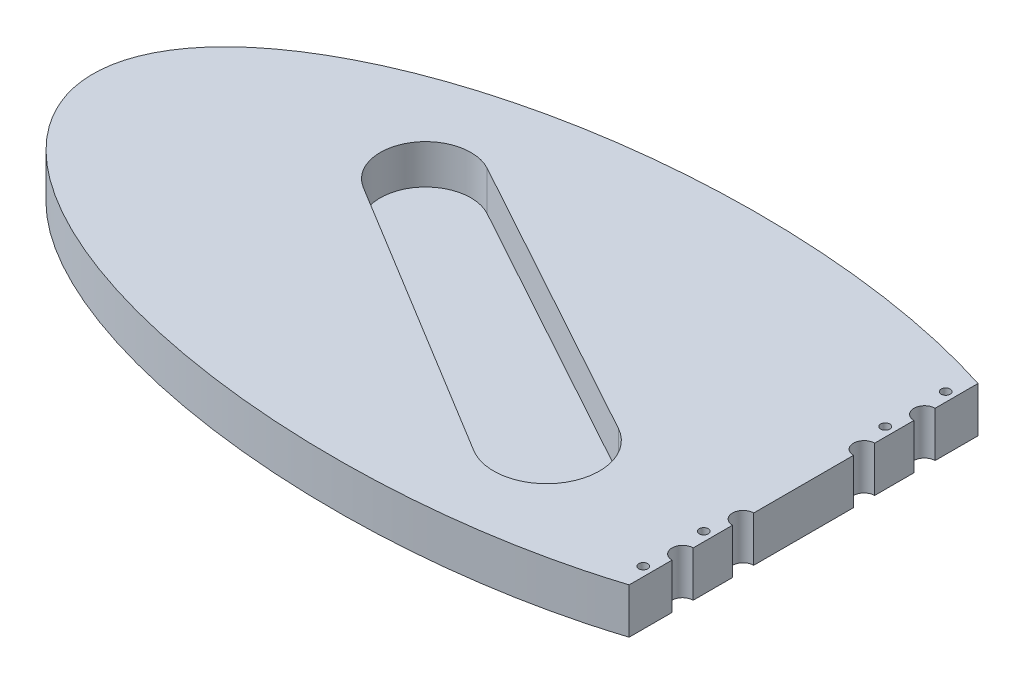
ISO-10303-21;
HEADER;
FILE_DESCRIPTION(('STEP AP214'),'2;1');
FILE_NAME('part.step','',(''),(''),'','','');
FILE_SCHEMA(('AUTOMOTIVE_DESIGN { 1 0 10303 214 1 1 1 1 }'));
ENDSEC;
DATA;
#1=APPLICATION_CONTEXT('core data for automotive mechanical design processes');
#2=APPLICATION_PROTOCOL_DEFINITION('international standard','automotive_design',2000,#1);
#3=PRODUCT_CONTEXT('',#1,'mechanical');
#4=PRODUCT('Part','Part','',(#3));
#5=PRODUCT_RELATED_PRODUCT_CATEGORY('part','',(#4));
#6=PRODUCT_DEFINITION_FORMATION('','',#4);
#7=PRODUCT_DEFINITION_CONTEXT('part definition',#1,'design');
#8=PRODUCT_DEFINITION('design','',#6,#7);
#9=PRODUCT_DEFINITION_SHAPE('','',#8);
#10=(LENGTH_UNIT() NAMED_UNIT(*) SI_UNIT(.MILLI.,.METRE.));
#11=(NAMED_UNIT(*) PLANE_ANGLE_UNIT() SI_UNIT($,.RADIAN.));
#12=(NAMED_UNIT(*) SI_UNIT($,.STERADIAN.) SOLID_ANGLE_UNIT());
#13=UNCERTAINTY_MEASURE_WITH_UNIT(LENGTH_MEASURE(1.E-05),#10,'distance_accuracy_value','');
#14=(GEOMETRIC_REPRESENTATION_CONTEXT(3) GLOBAL_UNCERTAINTY_ASSIGNED_CONTEXT((#13)) GLOBAL_UNIT_ASSIGNED_CONTEXT((#10,
#11,#12)) REPRESENTATION_CONTEXT('',''));
#15=CARTESIAN_POINT('',(0.,0.,0.));
#16=DIRECTION('',(0.,0.,1.));
#17=DIRECTION('',(1.,0.,0.));
#18=AXIS2_PLACEMENT_3D('',#15,#16,#17);
#19=CARTESIAN_POINT('',(84.9999999999999,15.,-57.6762997734387));
#20=DIRECTION('',(-1.,0.,0.));
#21=DIRECTION('',(0.,0.,1.));
#22=AXIS2_PLACEMENT_3D('',#19,#20,#21);
#23=PLANE('',#22);
#24=DIRECTION('',(0.,0.,-1.));
#25=VECTOR('',#24,1.);
#26=CARTESIAN_POINT('',(84.9999999999999,0.,-57.6762997734387));
#27=LINE('',#26,#25);
#28=CARTESIAN_POINT('',(85.,0.,16.5));
#29=VERTEX_POINT('',#28);
#30=CARTESIAN_POINT('',(84.9999999999999,0.,-16.5));
#31=VERTEX_POINT('',#30);
#32=EDGE_CURVE('E168',#29,#31,#27,.T.);
#33=ORIENTED_EDGE('',*,*,#32,.T.);
#34=DIRECTION('',(0.,1.,0.));
#35=VECTOR('',#34,1.);
#36=CARTESIAN_POINT('',(84.9999999999999,0.,-16.5));
#37=LINE('',#36,#35);
#38=CARTESIAN_POINT('',(84.9999999999999,15.,-16.5));
#39=VERTEX_POINT('',#38);
#40=EDGE_CURVE('E64',#31,#39,#37,.T.);
#41=ORIENTED_EDGE('',*,*,#40,.T.);
#42=DIRECTION('',(0.,0.,-1.));
#43=VECTOR('',#42,1.);
#44=CARTESIAN_POINT('',(84.9999999999999,15.,-57.6762997734387));
#45=LINE('',#44,#43);
#46=CARTESIAN_POINT('',(85.,15.,16.5));
#47=VERTEX_POINT('',#46);
#48=EDGE_CURVE('E270',#47,#39,#45,.T.);
#49=ORIENTED_EDGE('',*,*,#48,.F.);
#50=DIRECTION('',(0.,1.,0.));
#51=VECTOR('',#50,1.);
#52=CARTESIAN_POINT('',(85.,0.,16.5));
#53=LINE('',#52,#51);
#54=EDGE_CURVE('E194',#47,#29,#53,.F.);
#55=ORIENTED_EDGE('',*,*,#54,.T.);
#56=EDGE_LOOP('',(#33,#41,#49,#55));
#57=FACE_BOUND('',#56,.T.);
#58=ADVANCED_FACE('F39',(#57),#23,.F.);
#59=CARTESIAN_POINT('',(85.,0.,57.6762997734386));
#60=VERTEX_POINT('',#59);
#61=CARTESIAN_POINT('',(85.,0.,43.5));
#62=VERTEX_POINT('',#61);
#63=EDGE_CURVE('E165',#60,#62,#27,.T.);
#64=ORIENTED_EDGE('',*,*,#63,.T.);
#65=DIRECTION('',(0.,1.,0.));
#66=VECTOR('',#65,1.);
#67=CARTESIAN_POINT('',(85.,0.,43.5));
#68=LINE('',#67,#66);
#69=CARTESIAN_POINT('',(85.,15.,43.5));
#70=VERTEX_POINT('',#69);
#71=EDGE_CURVE('E207',#62,#70,#68,.T.);
#72=ORIENTED_EDGE('',*,*,#71,.T.);
#73=CARTESIAN_POINT('',(85.,15.,57.6762997734386));
#74=VERTEX_POINT('',#73);
#75=EDGE_CURVE('E260',#74,#70,#45,.T.);
#76=ORIENTED_EDGE('',*,*,#75,.F.);
#77=DIRECTION('',(0.,-1.,0.));
#78=VECTOR('',#77,1.);
#79=CARTESIAN_POINT('',(85.,15.,57.6762997734386));
#80=LINE('',#79,#78);
#81=EDGE_CURVE('E147',#74,#60,#80,.T.);
#82=ORIENTED_EDGE('',*,*,#81,.T.);
#83=EDGE_LOOP('',(#64,#72,#76,#82));
#84=FACE_BOUND('',#83,.T.);
#85=ADVANCED_FACE('F372',(#84),#23,.F.);
#86=CARTESIAN_POINT('',(85.,15.,36.5));
#87=VERTEX_POINT('',#86);
#88=CARTESIAN_POINT('',(85.,15.,23.5));
#89=VERTEX_POINT('',#88);
#90=EDGE_CURVE('E264',#87,#89,#45,.T.);
#91=ORIENTED_EDGE('',*,*,#90,.F.);
#92=DIRECTION('',(0.,1.,0.));
#93=VECTOR('',#92,1.);
#94=CARTESIAN_POINT('',(85.,0.,36.5));
#95=LINE('',#94,#93);
#96=CARTESIAN_POINT('',(85.,0.,36.5));
#97=VERTEX_POINT('',#96);
#98=EDGE_CURVE('E213',#87,#97,#95,.F.);
#99=ORIENTED_EDGE('',*,*,#98,.T.);
#100=CARTESIAN_POINT('',(85.,0.,23.5));
#101=VERTEX_POINT('',#100);
#102=EDGE_CURVE('E175',#97,#101,#27,.T.);
#103=ORIENTED_EDGE('',*,*,#102,.T.);
#104=DIRECTION('',(0.,1.,0.));
#105=VECTOR('',#104,1.);
#106=CARTESIAN_POINT('',(85.,0.,23.5));
#107=LINE('',#106,#105);
#108=EDGE_CURVE('E321',#101,#89,#107,.T.);
#109=ORIENTED_EDGE('',*,*,#108,.T.);
#110=EDGE_LOOP('',(#91,#99,#103,#109));
#111=FACE_BOUND('',#110,.T.);
#112=ADVANCED_FACE('F324',(#111),#23,.F.);
#113=CARTESIAN_POINT('',(84.9999999999999,15.,-23.5));
#114=VERTEX_POINT('',#113);
#115=CARTESIAN_POINT('',(84.9999999999999,15.,-36.5));
#116=VERTEX_POINT('',#115);
#117=EDGE_CURVE('E205',#114,#116,#45,.T.);
#118=ORIENTED_EDGE('',*,*,#117,.F.);
#119=DIRECTION('',(0.,1.,0.));
#120=VECTOR('',#119,1.);
#121=CARTESIAN_POINT('',(84.9999999999999,0.,-23.5));
#122=LINE('',#121,#120);
#123=CARTESIAN_POINT('',(84.9999999999999,0.,-23.5));
#124=VERTEX_POINT('',#123);
#125=EDGE_CURVE('E199',#114,#124,#122,.F.);
#126=ORIENTED_EDGE('',*,*,#125,.T.);
#127=CARTESIAN_POINT('',(84.9999999999999,0.,-36.5));
#128=VERTEX_POINT('',#127);
#129=EDGE_CURVE('E163',#124,#128,#27,.T.);
#130=ORIENTED_EDGE('',*,*,#129,.T.);
#131=DIRECTION('',(0.,1.,0.));
#132=VECTOR('',#131,1.);
#133=CARTESIAN_POINT('',(84.9999999999999,0.,-36.5));
#134=LINE('',#133,#132);
#135=EDGE_CURVE('E56',#128,#116,#134,.T.);
#136=ORIENTED_EDGE('',*,*,#135,.T.);
#137=EDGE_LOOP('',(#118,#126,#130,#136));
#138=FACE_BOUND('',#137,.T.);
#139=ADVANCED_FACE('F203',(#138),#23,.F.);
#140=CARTESIAN_POINT('',(0.,15.,0.));
#141=DIRECTION('',(0.,1.,0.));
#142=DIRECTION('',(-1.,0.,0.));
#143=AXIS2_PLACEMENT_3D('',#140,#141,#142);
#144=ELLIPSE('',#143,150.,70.);
#145=DIRECTION('',(0.,-1.,0.));
#146=VECTOR('',#145,1.);
#147=SURFACE_OF_LINEAR_EXTRUSION('',#144,#146);
#148=CARTESIAN_POINT('',(0.,0.,0.));
#149=DIRECTION('',(0.,1.,0.));
#150=DIRECTION('',(-1.,0.,0.));
#151=AXIS2_PLACEMENT_3D('',#148,#149,#150);
#152=ELLIPSE('',#151,150.,70.);
#153=CARTESIAN_POINT('',(84.9999999999999,0.,-57.6762997734387));
#154=VERTEX_POINT('',#153);
#155=EDGE_CURVE('E161',#154,#60,#152,.T.);
#156=ORIENTED_EDGE('',*,*,#155,.T.);
#157=ORIENTED_EDGE('',*,*,#81,.F.);
#158=CARTESIAN_POINT('',(84.9999999999999,15.,-57.6762997734387));
#159=VERTEX_POINT('',#158);
#160=EDGE_CURVE('E174',#159,#74,#144,.T.);
#161=ORIENTED_EDGE('',*,*,#160,.F.);
#162=DIRECTION('',(0.,-1.,0.));
#163=VECTOR('',#162,1.);
#164=CARTESIAN_POINT('',(84.9999999999999,15.,-57.6762997734387));
#165=LINE('',#164,#163);
#166=EDGE_CURVE('E263',#159,#154,#165,.T.);
#167=ORIENTED_EDGE('',*,*,#166,.T.);
#168=EDGE_LOOP('',(#156,#157,#161,#167));
#169=FACE_BOUND('',#168,.T.);
#170=ADVANCED_FACE('F41',(#169),#147,.F.);
#171=CARTESIAN_POINT('',(84.9999999999999,15.,-43.5));
#172=VERTEX_POINT('',#171);
#173=EDGE_CURVE('E154',#172,#159,#45,.T.);
#174=ORIENTED_EDGE('',*,*,#173,.F.);
#175=DIRECTION('',(0.,1.,0.));
#176=VECTOR('',#175,1.);
#177=CARTESIAN_POINT('',(84.9999999999999,0.,-43.5));
#178=LINE('',#177,#176);
#179=CARTESIAN_POINT('',(84.9999999999999,0.,-43.5));
#180=VERTEX_POINT('',#179);
#181=EDGE_CURVE('E140',#172,#180,#178,.F.);
#182=ORIENTED_EDGE('',*,*,#181,.T.);
#183=EDGE_CURVE('E152',#180,#154,#27,.T.);
#184=ORIENTED_EDGE('',*,*,#183,.T.);
#185=ORIENTED_EDGE('',*,*,#166,.F.);
#186=EDGE_LOOP('',(#174,#182,#184,#185));
#187=FACE_BOUND('',#186,.T.);
#188=ADVANCED_FACE('F150',(#187),#23,.F.);
#189=CARTESIAN_POINT('',(0.,15.,0.));
#190=DIRECTION('',(0.,1.,0.));
#191=DIRECTION('',(0.,0.,1.));
#192=AXIS2_PLACEMENT_3D('',#189,#190,#191);
#193=PLANE('',#192);
#194=CARTESIAN_POINT('',(82.,15.,50.));
#195=DIRECTION('',(0.,1.,0.));
#196=DIRECTION('',(0.,0.,-1.));
#197=AXIS2_PLACEMENT_3D('',#194,#195,#196);
#198=CIRCLE('',#197,1.5);
#199=CARTESIAN_POINT('',(82.,15.,48.5));
#200=VERTEX_POINT('',#199);
#201=EDGE_CURVE('E301',#200,#200,#198,.T.);
#202=ORIENTED_EDGE('',*,*,#201,.F.);
#203=EDGE_LOOP('',(#202));
#204=FACE_BOUND('',#203,.T.);
#205=CARTESIAN_POINT('',(82.,15.,-30.));
#206=DIRECTION('',(0.,1.,0.));
#207=DIRECTION('',(0.,0.,1.));
#208=AXIS2_PLACEMENT_3D('',#205,#206,#207);
#209=CIRCLE('',#208,1.5);
#210=CARTESIAN_POINT('',(82.,15.,-28.5));
#211=VERTEX_POINT('',#210);
#212=EDGE_CURVE('E293',#211,#211,#209,.T.);
#213=ORIENTED_EDGE('',*,*,#212,.F.);
#214=EDGE_LOOP('',(#213));
#215=FACE_BOUND('',#214,.T.);
#216=CARTESIAN_POINT('',(82.,15.,-50.));
#217=DIRECTION('',(0.,1.,0.));
#218=DIRECTION('',(0.,0.,1.));
#219=AXIS2_PLACEMENT_3D('',#216,#217,#218);
#220=CIRCLE('',#219,1.5);
#221=CARTESIAN_POINT('',(82.,15.,-48.5));
#222=VERTEX_POINT('',#221);
#223=EDGE_CURVE('E292',#222,#222,#220,.T.);
#224=ORIENTED_EDGE('',*,*,#223,.F.);
#225=EDGE_LOOP('',(#224));
#226=FACE_BOUND('',#225,.T.);
#227=CARTESIAN_POINT('',(85.,15.,-20.));
#228=DIRECTION('',(0.,1.,0.));
#229=DIRECTION('',(0.,0.,1.));
#230=AXIS2_PLACEMENT_3D('',#227,#228,#229);
#231=CIRCLE('',#230,3.50000000000001);
#232=EDGE_CURVE('E277',#114,#39,#231,.T.);
#233=ORIENTED_EDGE('',*,*,#232,.F.);
#234=ORIENTED_EDGE('',*,*,#117,.T.);
#235=CARTESIAN_POINT('',(85.,15.,-40.));
#236=DIRECTION('',(0.,1.,0.));
#237=DIRECTION('',(0.,0.,1.));
#238=AXIS2_PLACEMENT_3D('',#235,#236,#237);
#239=CIRCLE('',#238,3.50000000000001);
#240=EDGE_CURVE('E156',#172,#116,#239,.T.);
#241=ORIENTED_EDGE('',*,*,#240,.F.);
#242=ORIENTED_EDGE('',*,*,#173,.T.);
#243=ORIENTED_EDGE('',*,*,#160,.T.);
#244=ORIENTED_EDGE('',*,*,#75,.T.);
#245=CARTESIAN_POINT('',(85.,15.,40.));
#246=DIRECTION('',(0.,1.,0.));
#247=DIRECTION('',(0.,0.,-1.));
#248=AXIS2_PLACEMENT_3D('',#245,#246,#247);
#249=CIRCLE('',#248,3.50000000000001);
#250=EDGE_CURVE('E328',#87,#70,#249,.T.);
#251=ORIENTED_EDGE('',*,*,#250,.F.);
#252=ORIENTED_EDGE('',*,*,#90,.T.);
#253=CARTESIAN_POINT('',(85.,15.,20.));
#254=DIRECTION('',(0.,1.,0.));
#255=DIRECTION('',(0.,0.,-1.));
#256=AXIS2_PLACEMENT_3D('',#253,#254,#255);
#257=CIRCLE('',#256,3.50000000000001);
#258=EDGE_CURVE('E278',#47,#89,#257,.T.);
#259=ORIENTED_EDGE('',*,*,#258,.F.);
#260=ORIENTED_EDGE('',*,*,#48,.T.);
#261=EDGE_LOOP('',(#233,#234,#241,#242,#243,#244,#251,#252,#259,#260));
#262=FACE_BOUND('',#261,.T.);
#263=CARTESIAN_POINT('',(82.,15.,30.));
#264=DIRECTION('',(0.,1.,0.));
#265=DIRECTION('',(0.,0.,-1.));
#266=AXIS2_PLACEMENT_3D('',#263,#264,#265);
#267=CIRCLE('',#266,1.5);
#268=CARTESIAN_POINT('',(82.,15.,28.5));
#269=VERTEX_POINT('',#268);
#270=EDGE_CURVE('E284',#269,#269,#267,.T.);
#271=ORIENTED_EDGE('',*,*,#270,.F.);
#272=EDGE_LOOP('',(#271));
#273=FACE_BOUND('',#272,.T.);
#274=CARTESIAN_POINT('',(-65.,15.,-25.));
#275=DIRECTION('',(0.,1.,0.));
#276=DIRECTION('',(0.,0.,1.));
#277=AXIS2_PLACEMENT_3D('',#274,#275,#276);
#278=CIRCLE('',#277,15.);
#279=CARTESIAN_POINT('',(-57.782048400079,15.,-38.1491891271362));
#280=VERTEX_POINT('',#279);
#281=CARTESIAN_POINT('',(-72.8092379069749,15.,-12.193134524316));
#282=VERTEX_POINT('',#281);
#283=EDGE_CURVE('E211',#280,#282,#278,.T.);
#284=ORIENTED_EDGE('',*,*,#283,.F.);
#285=DIRECTION('',(-0.87661260847575,0.,-0.481196773328066));
#286=VECTOR('',#285,1.);
#287=CARTESIAN_POINT('',(-57.782048400079,15.,-38.1491891271362));
#288=LINE('',#287,#286);
#289=CARTESIAN_POINT('',(38.4209435332412,15.,14.6592793516744));
#290=VERTEX_POINT('',#289);
#291=EDGE_CURVE('E222',#290,#280,#288,.T.);
#292=ORIENTED_EDGE('',*,*,#291,.F.);
#293=CARTESIAN_POINT('',(30.,15.,30.));
#294=DIRECTION('',(0.,1.,0.));
#295=DIRECTION('',(0.,0.,1.));
#296=AXIS2_PLACEMENT_3D('',#293,#294,#295);
#297=CIRCLE('',#296,17.5);
#298=CARTESIAN_POINT('',(20.8892224418626,15.,44.9413430549646));
#299=VERTEX_POINT('',#298);
#300=EDGE_CURVE('E241',#299,#290,#297,.T.);
#301=ORIENTED_EDGE('',*,*,#300,.F.);
#302=DIRECTION('',(0.853791031712264,0.,0.520615860464995));
#303=VECTOR('',#302,1.);
#304=CARTESIAN_POINT('',(-72.8092379069749,15.,-12.193134524316));
#305=LINE('',#304,#303);
#306=EDGE_CURVE('E237',#282,#299,#305,.T.);
#307=ORIENTED_EDGE('',*,*,#306,.F.);
#308=EDGE_LOOP('',(#284,#292,#301,#307));
#309=FACE_BOUND('',#308,.T.);
#310=ADVANCED_FACE('F275',(#204,#215,#226,#262,#273,#309),#193,.T.);
#311=CARTESIAN_POINT('',(0.,0.,0.));
#312=DIRECTION('',(0.,1.,0.));
#313=DIRECTION('',(0.,0.,1.));
#314=AXIS2_PLACEMENT_3D('',#311,#312,#313);
#315=PLANE('',#314);
#316=CARTESIAN_POINT('',(82.,0.,50.));
#317=DIRECTION('',(0.,1.,0.));
#318=DIRECTION('',(0.,0.,-1.));
#319=AXIS2_PLACEMENT_3D('',#316,#317,#318);
#320=CIRCLE('',#319,1.5);
#321=CARTESIAN_POINT('',(82.,0.,48.5));
#322=VERTEX_POINT('',#321);
#323=EDGE_CURVE('E297',#322,#322,#320,.T.);
#324=ORIENTED_EDGE('',*,*,#323,.T.);
#325=EDGE_LOOP('',(#324));
#326=FACE_BOUND('',#325,.T.);
#327=CARTESIAN_POINT('',(82.,0.,-30.));
#328=DIRECTION('',(0.,1.,0.));
#329=DIRECTION('',(0.,0.,1.));
#330=AXIS2_PLACEMENT_3D('',#327,#328,#329);
#331=CIRCLE('',#330,1.5);
#332=CARTESIAN_POINT('',(82.,0.,-28.5));
#333=VERTEX_POINT('',#332);
#334=EDGE_CURVE('E288',#333,#333,#331,.T.);
#335=ORIENTED_EDGE('',*,*,#334,.T.);
#336=EDGE_LOOP('',(#335));
#337=FACE_BOUND('',#336,.T.);
#338=CARTESIAN_POINT('',(82.,0.,-50.));
#339=DIRECTION('',(0.,1.,0.));
#340=DIRECTION('',(0.,0.,1.));
#341=AXIS2_PLACEMENT_3D('',#338,#339,#340);
#342=CIRCLE('',#341,1.5);
#343=CARTESIAN_POINT('',(82.,0.,-48.5));
#344=VERTEX_POINT('',#343);
#345=EDGE_CURVE('E308',#344,#344,#342,.T.);
#346=ORIENTED_EDGE('',*,*,#345,.T.);
#347=EDGE_LOOP('',(#346));
#348=FACE_BOUND('',#347,.T.);
#349=CARTESIAN_POINT('',(82.,0.,30.));
#350=DIRECTION('',(0.,1.,0.));
#351=DIRECTION('',(0.,0.,-1.));
#352=AXIS2_PLACEMENT_3D('',#349,#350,#351);
#353=CIRCLE('',#352,1.5);
#354=CARTESIAN_POINT('',(82.,0.,28.5));
#355=VERTEX_POINT('',#354);
#356=EDGE_CURVE('E331',#355,#355,#353,.T.);
#357=ORIENTED_EDGE('',*,*,#356,.T.);
#358=EDGE_LOOP('',(#357));
#359=FACE_BOUND('',#358,.T.);
#360=ORIENTED_EDGE('',*,*,#129,.F.);
#361=CARTESIAN_POINT('',(85.,0.,-20.));
#362=DIRECTION('',(0.,1.,0.));
#363=DIRECTION('',(0.,0.,1.));
#364=AXIS2_PLACEMENT_3D('',#361,#362,#363);
#365=CIRCLE('',#364,3.50000000000001);
#366=EDGE_CURVE('E11',#124,#31,#365,.T.);
#367=ORIENTED_EDGE('',*,*,#366,.T.);
#368=ORIENTED_EDGE('',*,*,#32,.F.);
#369=CARTESIAN_POINT('',(85.,0.,20.));
#370=DIRECTION('',(0.,1.,0.));
#371=DIRECTION('',(0.,0.,-1.));
#372=AXIS2_PLACEMENT_3D('',#369,#370,#371);
#373=CIRCLE('',#372,3.50000000000001);
#374=EDGE_CURVE('E196',#29,#101,#373,.T.);
#375=ORIENTED_EDGE('',*,*,#374,.T.);
#376=ORIENTED_EDGE('',*,*,#102,.F.);
#377=CARTESIAN_POINT('',(85.,0.,40.));
#378=DIRECTION('',(0.,1.,0.));
#379=DIRECTION('',(0.,0.,-1.));
#380=AXIS2_PLACEMENT_3D('',#377,#378,#379);
#381=CIRCLE('',#380,3.50000000000001);
#382=EDGE_CURVE('E305',#97,#62,#381,.T.);
#383=ORIENTED_EDGE('',*,*,#382,.T.);
#384=ORIENTED_EDGE('',*,*,#63,.F.);
#385=ORIENTED_EDGE('',*,*,#155,.F.);
#386=ORIENTED_EDGE('',*,*,#183,.F.);
#387=CARTESIAN_POINT('',(85.,0.,-40.));
#388=DIRECTION('',(0.,1.,0.));
#389=DIRECTION('',(0.,0.,1.));
#390=AXIS2_PLACEMENT_3D('',#387,#388,#389);
#391=CIRCLE('',#390,3.50000000000001);
#392=EDGE_CURVE('E49',#180,#128,#391,.T.);
#393=ORIENTED_EDGE('',*,*,#392,.T.);
#394=EDGE_LOOP('',(#360,#367,#368,#375,#376,#383,#384,#385,#386,#393));
#395=FACE_BOUND('',#394,.T.);
#396=ADVANCED_FACE('F159',(#326,#337,#348,#359,#395),#315,.F.);
#397=CARTESIAN_POINT('',(-65.,2.,-25.));
#398=DIRECTION('',(0.,1.,0.));
#399=DIRECTION('',(0.,0.,1.));
#400=AXIS2_PLACEMENT_3D('',#397,#398,#399);
#401=CYLINDRICAL_SURFACE('',#400,15.);
#402=ORIENTED_EDGE('',*,*,#283,.T.);
#403=DIRECTION('',(0.,1.,0.));
#404=VECTOR('',#403,1.);
#405=CARTESIAN_POINT('',(-72.8092379069749,2.,-12.193134524316));
#406=LINE('',#405,#404);
#407=CARTESIAN_POINT('',(-72.8092379069749,2.,-12.193134524316));
#408=VERTEX_POINT('',#407);
#409=EDGE_CURVE('E234',#408,#282,#406,.T.);
#410=ORIENTED_EDGE('',*,*,#409,.F.);
#411=CARTESIAN_POINT('',(-65.,2.,-25.));
#412=DIRECTION('',(0.,1.,0.));
#413=DIRECTION('',(0.,0.,1.));
#414=AXIS2_PLACEMENT_3D('',#411,#412,#413);
#415=CIRCLE('',#414,15.);
#416=CARTESIAN_POINT('',(-57.782048400079,2.,-38.1491891271362));
#417=VERTEX_POINT('',#416);
#418=EDGE_CURVE('E217',#417,#408,#415,.T.);
#419=ORIENTED_EDGE('',*,*,#418,.F.);
#420=DIRECTION('',(0.,1.,0.));
#421=VECTOR('',#420,1.);
#422=CARTESIAN_POINT('',(-57.782048400079,2.,-38.1491891271362));
#423=LINE('',#422,#421);
#424=EDGE_CURVE('E169',#417,#280,#423,.T.);
#425=ORIENTED_EDGE('',*,*,#424,.T.);
#426=EDGE_LOOP('',(#402,#410,#419,#425));
#427=FACE_BOUND('',#426,.T.);
#428=ADVANCED_FACE('F350',(#427),#401,.F.);
#429=CARTESIAN_POINT('',(-57.782048400079,2.,-38.1491891271362));
#430=DIRECTION('',(0.481196773328066,0.,-0.87661260847575));
#431=DIRECTION('',(-0.87661260847575,0.,-0.481196773328066));
#432=AXIS2_PLACEMENT_3D('',#429,#430,#431);
#433=PLANE('',#432);
#434=ORIENTED_EDGE('',*,*,#291,.T.);
#435=ORIENTED_EDGE('',*,*,#424,.F.);
#436=DIRECTION('',(-0.87661260847575,0.,-0.481196773328066));
#437=VECTOR('',#436,1.);
#438=CARTESIAN_POINT('',(-57.782048400079,2.,-38.1491891271362));
#439=LINE('',#438,#437);
#440=CARTESIAN_POINT('',(38.4209435332412,2.,14.6592793516744));
#441=VERTEX_POINT('',#440);
#442=EDGE_CURVE('E230',#441,#417,#439,.T.);
#443=ORIENTED_EDGE('',*,*,#442,.F.);
#444=DIRECTION('',(0.,1.,0.));
#445=VECTOR('',#444,1.);
#446=CARTESIAN_POINT('',(38.4209435332412,2.,14.6592793516744));
#447=LINE('',#446,#445);
#448=EDGE_CURVE('E250',#441,#290,#447,.T.);
#449=ORIENTED_EDGE('',*,*,#448,.T.);
#450=EDGE_LOOP('',(#434,#435,#443,#449));
#451=FACE_BOUND('',#450,.T.);
#452=ADVANCED_FACE('F360',(#451),#433,.F.);
#453=CARTESIAN_POINT('',(30.,2.,30.));
#454=DIRECTION('',(0.,1.,0.));
#455=DIRECTION('',(0.,0.,1.));
#456=AXIS2_PLACEMENT_3D('',#453,#454,#455);
#457=CYLINDRICAL_SURFACE('',#456,17.5);
#458=ORIENTED_EDGE('',*,*,#300,.T.);
#459=ORIENTED_EDGE('',*,*,#448,.F.);
#460=CARTESIAN_POINT('',(30.,2.,30.));
#461=DIRECTION('',(0.,1.,0.));
#462=DIRECTION('',(0.,0.,1.));
#463=AXIS2_PLACEMENT_3D('',#460,#461,#462);
#464=CIRCLE('',#463,17.5);
#465=CARTESIAN_POINT('',(20.8892224418626,2.,44.9413430549646));
#466=VERTEX_POINT('',#465);
#467=EDGE_CURVE('E226',#466,#441,#464,.T.);
#468=ORIENTED_EDGE('',*,*,#467,.F.);
#469=DIRECTION('',(0.,1.,0.));
#470=VECTOR('',#469,1.);
#471=CARTESIAN_POINT('',(20.8892224418626,2.,44.9413430549646));
#472=LINE('',#471,#470);
#473=EDGE_CURVE('E253',#466,#299,#472,.T.);
#474=ORIENTED_EDGE('',*,*,#473,.T.);
#475=EDGE_LOOP('',(#458,#459,#468,#474));
#476=FACE_BOUND('',#475,.T.);
#477=ADVANCED_FACE('F362',(#476),#457,.F.);
#478=CARTESIAN_POINT('',(-72.8092379069749,2.,-12.193134524316));
#479=DIRECTION('',(-0.520615860464995,0.,0.853791031712264));
#480=DIRECTION('',(0.853791031712264,0.,0.520615860464995));
#481=AXIS2_PLACEMENT_3D('',#478,#479,#480);
#482=PLANE('',#481);
#483=ORIENTED_EDGE('',*,*,#306,.T.);
#484=ORIENTED_EDGE('',*,*,#473,.F.);
#485=DIRECTION('',(0.853791031712264,0.,0.520615860464995));
#486=VECTOR('',#485,1.);
#487=CARTESIAN_POINT('',(-72.8092379069749,2.,-12.193134524316));
#488=LINE('',#487,#486);
#489=EDGE_CURVE('E221',#408,#466,#488,.T.);
#490=ORIENTED_EDGE('',*,*,#489,.F.);
#491=ORIENTED_EDGE('',*,*,#409,.T.);
#492=EDGE_LOOP('',(#483,#484,#490,#491));
#493=FACE_BOUND('',#492,.T.);
#494=ADVANCED_FACE('F354',(#493),#482,.F.);
#495=CARTESIAN_POINT('',(-65.,2.,-25.));
#496=DIRECTION('',(0.,1.,0.));
#497=DIRECTION('',(0.,0.,1.));
#498=AXIS2_PLACEMENT_3D('',#495,#496,#497);
#499=PLANE('',#498);
#500=ORIENTED_EDGE('',*,*,#418,.T.);
#501=ORIENTED_EDGE('',*,*,#489,.T.);
#502=ORIENTED_EDGE('',*,*,#467,.T.);
#503=ORIENTED_EDGE('',*,*,#442,.T.);
#504=EDGE_LOOP('',(#500,#501,#502,#503));
#505=FACE_BOUND('',#504,.T.);
#506=ADVANCED_FACE('F357',(#505),#499,.T.);
#507=CARTESIAN_POINT('',(85.,0.,-40.));
#508=DIRECTION('',(0.,1.,0.));
#509=DIRECTION('',(0.,0.,1.));
#510=AXIS2_PLACEMENT_3D('',#507,#508,#509);
#511=CYLINDRICAL_SURFACE('',#510,3.50000000000001);
#512=ORIENTED_EDGE('',*,*,#392,.F.);
#513=ORIENTED_EDGE('',*,*,#181,.F.);
#514=ORIENTED_EDGE('',*,*,#240,.T.);
#515=ORIENTED_EDGE('',*,*,#135,.F.);
#516=EDGE_LOOP('',(#512,#513,#514,#515));
#517=FACE_BOUND('',#516,.T.);
#518=ADVANCED_FACE('F139',(#517),#511,.F.);
#519=CARTESIAN_POINT('',(85.,0.,20.));
#520=DIRECTION('',(0.,1.,0.));
#521=DIRECTION('',(0.,0.,1.));
#522=AXIS2_PLACEMENT_3D('',#519,#520,#521);
#523=CYLINDRICAL_SURFACE('',#522,3.50000000000001);
#524=ORIENTED_EDGE('',*,*,#374,.F.);
#525=ORIENTED_EDGE('',*,*,#54,.F.);
#526=ORIENTED_EDGE('',*,*,#258,.T.);
#527=ORIENTED_EDGE('',*,*,#108,.F.);
#528=EDGE_LOOP('',(#524,#525,#526,#527));
#529=FACE_BOUND('',#528,.T.);
#530=ADVANCED_FACE('F461',(#529),#523,.F.);
#531=CARTESIAN_POINT('',(82.,0.,30.));
#532=DIRECTION('',(0.,1.,0.));
#533=DIRECTION('',(0.,0.,1.));
#534=AXIS2_PLACEMENT_3D('',#531,#532,#533);
#535=CYLINDRICAL_SURFACE('',#534,1.5);
#536=ORIENTED_EDGE('',*,*,#356,.F.);
#537=EDGE_LOOP('',(#536));
#538=FACE_BOUND('',#537,.T.);
#539=ORIENTED_EDGE('',*,*,#270,.T.);
#540=EDGE_LOOP('',(#539));
#541=FACE_BOUND('',#540,.T.);
#542=ADVANCED_FACE('F340',(#538,#541),#535,.F.);
#543=CARTESIAN_POINT('',(85.,0.,40.));
#544=DIRECTION('',(0.,1.,0.));
#545=DIRECTION('',(0.,0.,1.));
#546=AXIS2_PLACEMENT_3D('',#543,#544,#545);
#547=CYLINDRICAL_SURFACE('',#546,3.50000000000001);
#548=ORIENTED_EDGE('',*,*,#382,.F.);
#549=ORIENTED_EDGE('',*,*,#98,.F.);
#550=ORIENTED_EDGE('',*,*,#250,.T.);
#551=ORIENTED_EDGE('',*,*,#71,.F.);
#552=EDGE_LOOP('',(#548,#549,#550,#551));
#553=FACE_BOUND('',#552,.T.);
#554=ADVANCED_FACE('F478',(#553),#547,.F.);
#555=CARTESIAN_POINT('',(85.,0.,-20.));
#556=DIRECTION('',(0.,1.,0.));
#557=DIRECTION('',(0.,0.,1.));
#558=AXIS2_PLACEMENT_3D('',#555,#556,#557);
#559=CYLINDRICAL_SURFACE('',#558,3.50000000000001);
#560=ORIENTED_EDGE('',*,*,#366,.F.);
#561=ORIENTED_EDGE('',*,*,#125,.F.);
#562=ORIENTED_EDGE('',*,*,#232,.T.);
#563=ORIENTED_EDGE('',*,*,#40,.F.);
#564=EDGE_LOOP('',(#560,#561,#562,#563));
#565=FACE_BOUND('',#564,.T.);
#566=ADVANCED_FACE('F198',(#565),#559,.F.);
#567=CARTESIAN_POINT('',(82.,0.,-50.));
#568=DIRECTION('',(0.,1.,0.));
#569=DIRECTION('',(0.,0.,1.));
#570=AXIS2_PLACEMENT_3D('',#567,#568,#569);
#571=CYLINDRICAL_SURFACE('',#570,1.5);
#572=ORIENTED_EDGE('',*,*,#345,.F.);
#573=EDGE_LOOP('',(#572));
#574=FACE_BOUND('',#573,.T.);
#575=ORIENTED_EDGE('',*,*,#223,.T.);
#576=EDGE_LOOP('',(#575));
#577=FACE_BOUND('',#576,.T.);
#578=ADVANCED_FACE('F496',(#574,#577),#571,.F.);
#579=CARTESIAN_POINT('',(82.,0.,-30.));
#580=DIRECTION('',(0.,1.,0.));
#581=DIRECTION('',(0.,0.,1.));
#582=AXIS2_PLACEMENT_3D('',#579,#580,#581);
#583=CYLINDRICAL_SURFACE('',#582,1.5);
#584=ORIENTED_EDGE('',*,*,#334,.F.);
#585=EDGE_LOOP('',(#584));
#586=FACE_BOUND('',#585,.T.);
#587=ORIENTED_EDGE('',*,*,#212,.T.);
#588=EDGE_LOOP('',(#587));
#589=FACE_BOUND('',#588,.T.);
#590=ADVANCED_FACE('F505',(#586,#589),#583,.F.);
#591=CARTESIAN_POINT('',(82.,0.,50.));
#592=DIRECTION('',(0.,1.,0.));
#593=DIRECTION('',(0.,0.,1.));
#594=AXIS2_PLACEMENT_3D('',#591,#592,#593);
#595=CYLINDRICAL_SURFACE('',#594,1.5);
#596=ORIENTED_EDGE('',*,*,#323,.F.);
#597=EDGE_LOOP('',(#596));
#598=FACE_BOUND('',#597,.T.);
#599=ORIENTED_EDGE('',*,*,#201,.T.);
#600=EDGE_LOOP('',(#599));
#601=FACE_BOUND('',#600,.T.);
#602=ADVANCED_FACE('F515',(#598,#601),#595,.F.);
#603=CLOSED_SHELL('',(#58,#85,#112,#139,#170,#188,#310,#396,#428,#452,#477,#494,#506,#518,#530,
#542,#554,#566,#578,#590,#602));
#604=MANIFOLD_SOLID_BREP('B2',#603);
#605=ADVANCED_BREP_SHAPE_REPRESENTATION('',(#18,#604),#14);
#606=SHAPE_DEFINITION_REPRESENTATION(#9,#605);
ENDSEC;
END-ISO-10303-21;
